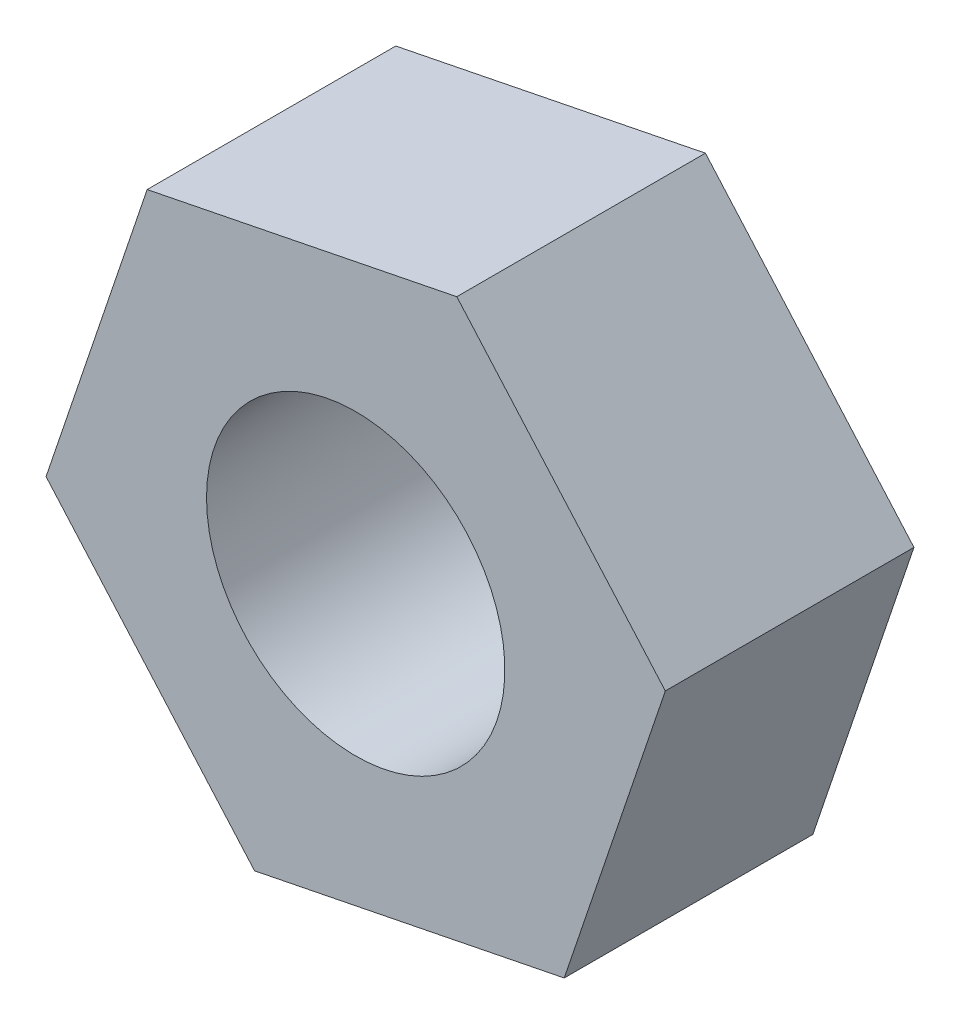
ISO-10303-21;
HEADER;
FILE_DESCRIPTION(('STEP AP214'),'2;1');
FILE_NAME('part.step','',(''),(''),'','','');
FILE_SCHEMA(('AUTOMOTIVE_DESIGN { 1 0 10303 214 1 1 1 1 }'));
ENDSEC;
DATA;
#1=APPLICATION_CONTEXT('core data for automotive mechanical design processes');
#2=APPLICATION_PROTOCOL_DEFINITION('international standard','automotive_design',2000,#1);
#3=PRODUCT_CONTEXT('',#1,'mechanical');
#4=PRODUCT('Part','Part','',(#3));
#5=PRODUCT_RELATED_PRODUCT_CATEGORY('part','',(#4));
#6=PRODUCT_DEFINITION_FORMATION('','',#4);
#7=PRODUCT_DEFINITION_CONTEXT('part definition',#1,'design');
#8=PRODUCT_DEFINITION('design','',#6,#7);
#9=PRODUCT_DEFINITION_SHAPE('','',#8);
#10=(LENGTH_UNIT() NAMED_UNIT(*) SI_UNIT(.MILLI.,.METRE.));
#11=(NAMED_UNIT(*) PLANE_ANGLE_UNIT() SI_UNIT($,.RADIAN.));
#12=(NAMED_UNIT(*) SI_UNIT($,.STERADIAN.) SOLID_ANGLE_UNIT());
#13=UNCERTAINTY_MEASURE_WITH_UNIT(LENGTH_MEASURE(1.E-05),#10,'distance_accuracy_value','');
#14=(GEOMETRIC_REPRESENTATION_CONTEXT(3) GLOBAL_UNCERTAINTY_ASSIGNED_CONTEXT((#13)) GLOBAL_UNIT_ASSIGNED_CONTEXT((#10,
#11,#12)) REPRESENTATION_CONTEXT('',''));
#15=CARTESIAN_POINT('',(0.,0.,0.));
#16=DIRECTION('',(0.,0.,1.));
#17=DIRECTION('',(1.,0.,0.));
#18=AXIS2_PLACEMENT_3D('',#15,#16,#17);
#19=CARTESIAN_POINT('',(21.000000000002,781.,-4.99999999999961));
#20=DIRECTION('',(0.,0.,-1.));
#21=DIRECTION('',(-1.,0.,0.));
#22=AXIS2_PLACEMENT_3D('',#19,#20,#21);
#23=PLANE('',#22);
#24=DIRECTION('',(-0.980523085240552,-0.196403867859952,0.));
#25=VECTOR('',#24,1.);
#26=CARTESIAN_POINT('',(25.1938002428883,776.230789074061,-4.99999999999961));
#27=LINE('',#26,#25);
#28=CARTESIAN_POINT('',(25.1938002428883,776.230789074061,-4.99999999999961));
#29=VERTEX_POINT('',#28);
#30=CARTESIAN_POINT('',(18.9666423035752,774.983456988293,-4.99999999999961));
#31=VERTEX_POINT('',#30);
#32=EDGE_CURVE('E112',#29,#31,#27,.T.);
#33=ORIENTED_EDGE('',*,*,#32,.T.);
#34=DIRECTION('',(-0.660352281588516,0.750955966885436,0.));
#35=VECTOR('',#34,1.);
#36=CARTESIAN_POINT('',(18.9666423035752,774.983456988293,-4.99999999999961));
#37=LINE('',#36,#35);
#38=CARTESIAN_POINT('',(14.772842060689,779.752667914233,-4.99999999999961));
#39=VERTEX_POINT('',#38);
#40=EDGE_CURVE('E70',#31,#39,#37,.T.);
#41=ORIENTED_EDGE('',*,*,#40,.T.);
#42=DIRECTION('',(0.320170803652035,0.947359834745388,0.));
#43=VECTOR('',#42,1.);
#44=CARTESIAN_POINT('',(14.772842060689,779.752667914233,-4.99999999999961));
#45=LINE('',#44,#43);
#46=CARTESIAN_POINT('',(16.8061997571158,785.76921092594,-4.99999999999961));
#47=VERTEX_POINT('',#46);
#48=EDGE_CURVE('E83',#39,#47,#45,.T.);
#49=ORIENTED_EDGE('',*,*,#48,.T.);
#50=DIRECTION('',(0.980523085240552,0.196403867859952,0.));
#51=VECTOR('',#50,1.);
#52=CARTESIAN_POINT('',(16.8061997571158,785.76921092594,-4.99999999999961));
#53=LINE('',#52,#51);
#54=CARTESIAN_POINT('',(23.0333576964288,787.016543011707,-4.99999999999961));
#55=VERTEX_POINT('',#54);
#56=EDGE_CURVE('E77',#47,#55,#53,.T.);
#57=ORIENTED_EDGE('',*,*,#56,.T.);
#58=DIRECTION('',(0.660352281588516,-0.750955966885436,0.));
#59=VECTOR('',#58,1.);
#60=CARTESIAN_POINT('',(23.0333576964288,787.016543011707,-4.99999999999961));
#61=LINE('',#60,#59);
#62=CARTESIAN_POINT('',(27.227157939315,782.247332085767,-4.99999999999961));
#63=VERTEX_POINT('',#62);
#64=EDGE_CURVE('E81',#55,#63,#61,.T.);
#65=ORIENTED_EDGE('',*,*,#64,.T.);
#66=DIRECTION('',(-0.320170803652035,-0.947359834745388,0.));
#67=VECTOR('',#66,1.);
#68=CARTESIAN_POINT('',(27.227157939315,782.247332085767,-4.99999999999961));
#69=LINE('',#68,#67);
#70=EDGE_CURVE('E33',#63,#29,#69,.T.);
#71=ORIENTED_EDGE('',*,*,#70,.T.);
#72=EDGE_LOOP('',(#33,#41,#49,#57,#65,#71));
#73=FACE_BOUND('',#72,.T.);
#74=CARTESIAN_POINT('',(21.000000000002,781.,-4.99999999999961));
#75=DIRECTION('',(0.,0.,-1.));
#76=DIRECTION('',(-1.,0.,0.));
#77=AXIS2_PLACEMENT_3D('',#74,#75,#76);
#78=CIRCLE('',#77,3.);
#79=CARTESIAN_POINT('',(18.000000000002,781.,-4.99999999999961));
#80=VERTEX_POINT('',#79);
#81=EDGE_CURVE('E105',#80,#80,#78,.T.);
#82=ORIENTED_EDGE('',*,*,#81,.F.);
#83=EDGE_LOOP('',(#82));
#84=FACE_BOUND('',#83,.T.);
#85=ADVANCED_FACE('F16',(#73,#84),#23,.T.);
#86=CARTESIAN_POINT('',(21.000000000002,781.,3.88578058618805E-13));
#87=DIRECTION('',(0.,0.,-1.));
#88=DIRECTION('',(-1.,0.,0.));
#89=AXIS2_PLACEMENT_3D('',#86,#87,#88);
#90=PLANE('',#89);
#91=DIRECTION('',(-0.980523085240552,-0.196403867859952,0.));
#92=VECTOR('',#91,1.);
#93=CARTESIAN_POINT('',(25.1938002428883,776.230789074061,3.88578058618805E-13));
#94=LINE('',#93,#92);
#95=CARTESIAN_POINT('',(25.1938002428883,776.230789074061,3.88578058618805E-13));
#96=VERTEX_POINT('',#95);
#97=CARTESIAN_POINT('',(18.9666423035752,774.983456988293,3.88578058618805E-13));
#98=VERTEX_POINT('',#97);
#99=EDGE_CURVE('E101',#96,#98,#94,.T.);
#100=ORIENTED_EDGE('',*,*,#99,.F.);
#101=DIRECTION('',(-0.320170803652035,-0.947359834745388,0.));
#102=VECTOR('',#101,1.);
#103=CARTESIAN_POINT('',(27.227157939315,782.247332085767,3.88578058618805E-13));
#104=LINE('',#103,#102);
#105=CARTESIAN_POINT('',(27.227157939315,782.247332085767,3.88578058618805E-13));
#106=VERTEX_POINT('',#105);
#107=EDGE_CURVE('E62',#106,#96,#104,.T.);
#108=ORIENTED_EDGE('',*,*,#107,.F.);
#109=DIRECTION('',(0.660352281588516,-0.750955966885436,0.));
#110=VECTOR('',#109,1.);
#111=CARTESIAN_POINT('',(23.0333576964288,787.016543011707,3.88578058618805E-13));
#112=LINE('',#111,#110);
#113=CARTESIAN_POINT('',(23.0333576964288,787.016543011707,3.88578058618805E-13));
#114=VERTEX_POINT('',#113);
#115=EDGE_CURVE('E56',#114,#106,#112,.T.);
#116=ORIENTED_EDGE('',*,*,#115,.F.);
#117=DIRECTION('',(0.980523085240552,0.196403867859952,0.));
#118=VECTOR('',#117,1.);
#119=CARTESIAN_POINT('',(16.8061997571158,785.76921092594,3.88578058618805E-13));
#120=LINE('',#119,#118);
#121=CARTESIAN_POINT('',(16.8061997571158,785.76921092594,3.88578058618805E-13));
#122=VERTEX_POINT('',#121);
#123=EDGE_CURVE('E91',#122,#114,#120,.T.);
#124=ORIENTED_EDGE('',*,*,#123,.F.);
#125=DIRECTION('',(0.320170803652035,0.947359834745388,0.));
#126=VECTOR('',#125,1.);
#127=CARTESIAN_POINT('',(14.772842060689,779.752667914233,3.88578058618805E-13));
#128=LINE('',#127,#126);
#129=CARTESIAN_POINT('',(14.772842060689,779.752667914233,3.88578058618805E-13));
#130=VERTEX_POINT('',#129);
#131=EDGE_CURVE('E107',#130,#122,#128,.T.);
#132=ORIENTED_EDGE('',*,*,#131,.F.);
#133=DIRECTION('',(-0.660352281588516,0.750955966885436,0.));
#134=VECTOR('',#133,1.);
#135=CARTESIAN_POINT('',(18.9666423035752,774.983456988293,3.88578058618805E-13));
#136=LINE('',#135,#134);
#137=EDGE_CURVE('E104',#98,#130,#136,.T.);
#138=ORIENTED_EDGE('',*,*,#137,.F.);
#139=EDGE_LOOP('',(#100,#108,#116,#124,#132,#138));
#140=FACE_BOUND('',#139,.T.);
#141=CARTESIAN_POINT('',(21.000000000002,781.,3.88578058618805E-13));
#142=DIRECTION('',(0.,0.,-1.));
#143=DIRECTION('',(-1.,0.,0.));
#144=AXIS2_PLACEMENT_3D('',#141,#142,#143);
#145=CIRCLE('',#144,3.);
#146=CARTESIAN_POINT('',(18.000000000002,781.,3.88578058618805E-13));
#147=VERTEX_POINT('',#146);
#148=EDGE_CURVE('E246',#147,#147,#145,.T.);
#149=ORIENTED_EDGE('',*,*,#148,.T.);
#150=EDGE_LOOP('',(#149));
#151=FACE_BOUND('',#150,.T.);
#152=ADVANCED_FACE('F121',(#140,#151),#90,.F.);
#153=CARTESIAN_POINT('',(25.1938002428883,776.230789074061,-4.99999999999961));
#154=DIRECTION('',(-0.196403867859952,0.980523085240552,0.));
#155=DIRECTION('',(0.980523085240552,0.196403867859952,0.));
#156=AXIS2_PLACEMENT_3D('',#153,#154,#155);
#157=PLANE('',#156);
#158=ORIENTED_EDGE('',*,*,#99,.T.);
#159=DIRECTION('',(0.,0.,1.));
#160=VECTOR('',#159,1.);
#161=CARTESIAN_POINT('',(18.9666423035752,774.983456988293,-4.99999999999961));
#162=LINE('',#161,#160);
#163=EDGE_CURVE('E11',#31,#98,#162,.T.);
#164=ORIENTED_EDGE('',*,*,#163,.F.);
#165=ORIENTED_EDGE('',*,*,#32,.F.);
#166=DIRECTION('',(0.,0.,1.));
#167=VECTOR('',#166,1.);
#168=CARTESIAN_POINT('',(25.1938002428883,776.230789074061,-4.99999999999961));
#169=LINE('',#168,#167);
#170=EDGE_CURVE('E97',#29,#96,#169,.T.);
#171=ORIENTED_EDGE('',*,*,#170,.T.);
#172=EDGE_LOOP('',(#158,#164,#165,#171));
#173=FACE_BOUND('',#172,.T.);
#174=ADVANCED_FACE('F18',(#173),#157,.F.);
#175=CARTESIAN_POINT('',(18.9666423035752,774.983456988293,-4.99999999999961));
#176=DIRECTION('',(0.750955966885436,0.660352281588516,0.));
#177=DIRECTION('',(0.660352281588517,-0.750955966885437,0.));
#178=AXIS2_PLACEMENT_3D('',#175,#176,#177);
#179=PLANE('',#178);
#180=ORIENTED_EDGE('',*,*,#137,.T.);
#181=DIRECTION('',(0.,0.,1.));
#182=VECTOR('',#181,1.);
#183=CARTESIAN_POINT('',(14.772842060689,779.752667914233,-4.99999999999961));
#184=LINE('',#183,#182);
#185=EDGE_CURVE('E25',#39,#130,#184,.T.);
#186=ORIENTED_EDGE('',*,*,#185,.F.);
#187=ORIENTED_EDGE('',*,*,#40,.F.);
#188=ORIENTED_EDGE('',*,*,#163,.T.);
#189=EDGE_LOOP('',(#180,#186,#187,#188));
#190=FACE_BOUND('',#189,.T.);
#191=ADVANCED_FACE('F147',(#190),#179,.F.);
#192=CARTESIAN_POINT('',(14.772842060689,779.752667914233,-4.99999999999961));
#193=DIRECTION('',(0.947359834745389,-0.320170803652035,0.));
#194=DIRECTION('',(-0.320170803652035,-0.947359834745389,0.));
#195=AXIS2_PLACEMENT_3D('',#192,#193,#194);
#196=PLANE('',#195);
#197=ORIENTED_EDGE('',*,*,#131,.T.);
#198=DIRECTION('',(0.,0.,1.));
#199=VECTOR('',#198,1.);
#200=CARTESIAN_POINT('',(16.8061997571158,785.76921092594,-4.99999999999961));
#201=LINE('',#200,#199);
#202=EDGE_CURVE('E92',#47,#122,#201,.T.);
#203=ORIENTED_EDGE('',*,*,#202,.F.);
#204=ORIENTED_EDGE('',*,*,#48,.F.);
#205=ORIENTED_EDGE('',*,*,#185,.T.);
#206=EDGE_LOOP('',(#197,#203,#204,#205));
#207=FACE_BOUND('',#206,.T.);
#208=ADVANCED_FACE('F118',(#207),#196,.F.);
#209=CARTESIAN_POINT('',(16.8061997571158,785.76921092594,-4.99999999999961));
#210=DIRECTION('',(0.196403867859952,-0.980523085240552,0.));
#211=DIRECTION('',(-0.980523085240552,-0.196403867859952,0.));
#212=AXIS2_PLACEMENT_3D('',#209,#210,#211);
#213=PLANE('',#212);
#214=ORIENTED_EDGE('',*,*,#123,.T.);
#215=DIRECTION('',(0.,0.,1.));
#216=VECTOR('',#215,1.);
#217=CARTESIAN_POINT('',(23.0333576964288,787.016543011707,-4.99999999999961));
#218=LINE('',#217,#216);
#219=EDGE_CURVE('E88',#55,#114,#218,.T.);
#220=ORIENTED_EDGE('',*,*,#219,.F.);
#221=ORIENTED_EDGE('',*,*,#56,.F.);
#222=ORIENTED_EDGE('',*,*,#202,.T.);
#223=EDGE_LOOP('',(#214,#220,#221,#222));
#224=FACE_BOUND('',#223,.T.);
#225=ADVANCED_FACE('F89',(#224),#213,.F.);
#226=CARTESIAN_POINT('',(23.0333576964288,787.016543011707,-4.99999999999961));
#227=DIRECTION('',(-0.750955966885436,-0.660352281588516,0.));
#228=DIRECTION('',(-0.660352281588517,0.750955966885437,0.));
#229=AXIS2_PLACEMENT_3D('',#226,#227,#228);
#230=PLANE('',#229);
#231=ORIENTED_EDGE('',*,*,#115,.T.);
#232=DIRECTION('',(0.,0.,1.));
#233=VECTOR('',#232,1.);
#234=CARTESIAN_POINT('',(27.227157939315,782.247332085767,-4.99999999999961));
#235=LINE('',#234,#233);
#236=EDGE_CURVE('E93',#63,#106,#235,.T.);
#237=ORIENTED_EDGE('',*,*,#236,.F.);
#238=ORIENTED_EDGE('',*,*,#64,.F.);
#239=ORIENTED_EDGE('',*,*,#219,.T.);
#240=EDGE_LOOP('',(#231,#237,#238,#239));
#241=FACE_BOUND('',#240,.T.);
#242=ADVANCED_FACE('F95',(#241),#230,.F.);
#243=CARTESIAN_POINT('',(27.227157939315,782.247332085767,-4.99999999999961));
#244=DIRECTION('',(-0.947359834745389,0.320170803652035,0.));
#245=DIRECTION('',(0.320170803652035,0.947359834745389,0.));
#246=AXIS2_PLACEMENT_3D('',#243,#244,#245);
#247=PLANE('',#246);
#248=ORIENTED_EDGE('',*,*,#107,.T.);
#249=ORIENTED_EDGE('',*,*,#170,.F.);
#250=ORIENTED_EDGE('',*,*,#70,.F.);
#251=ORIENTED_EDGE('',*,*,#236,.T.);
#252=EDGE_LOOP('',(#248,#249,#250,#251));
#253=FACE_BOUND('',#252,.T.);
#254=ADVANCED_FACE('F126',(#253),#247,.F.);
#255=CARTESIAN_POINT('',(21.000000000002,781.,-4.99999999999961));
#256=DIRECTION('',(0.,0.,1.));
#257=DIRECTION('',(1.,0.,0.));
#258=AXIS2_PLACEMENT_3D('',#255,#256,#257);
#259=CYLINDRICAL_SURFACE('',#258,3.);
#260=ORIENTED_EDGE('',*,*,#81,.T.);
#261=EDGE_LOOP('',(#260));
#262=FACE_BOUND('',#261,.T.);
#263=ORIENTED_EDGE('',*,*,#148,.F.);
#264=EDGE_LOOP('',(#263));
#265=FACE_BOUND('',#264,.T.);
#266=ADVANCED_FACE('F128',(#262,#265),#259,.F.);
#267=CLOSED_SHELL('',(#85,#152,#174,#191,#208,#225,#242,#254,#266));
#268=MANIFOLD_SOLID_BREP('B1',#267);
#269=ADVANCED_BREP_SHAPE_REPRESENTATION('',(#18,#268),#14);
#270=SHAPE_DEFINITION_REPRESENTATION(#9,#269);
ENDSEC;
END-ISO-10303-21;
